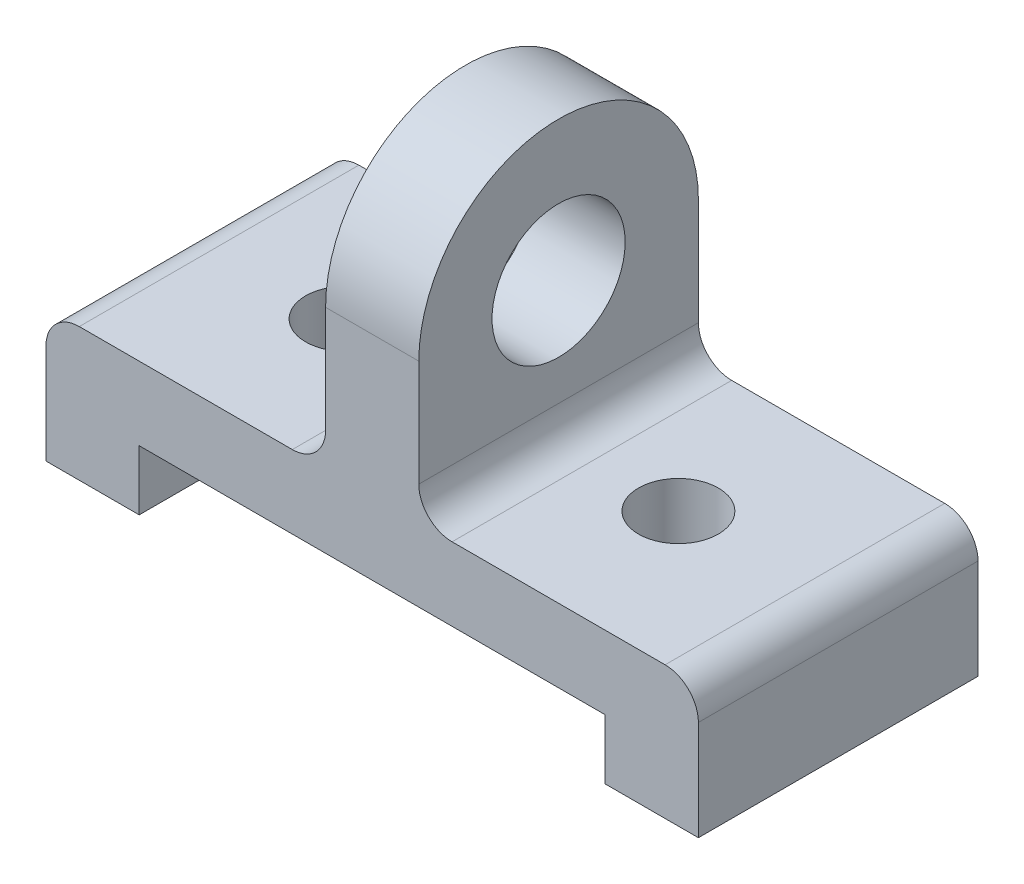
ISO-10303-21;
HEADER;
FILE_DESCRIPTION(('STEP AP214'),'2;1');
FILE_NAME('part.step','',(''),(''),'','','');
FILE_SCHEMA(('AUTOMOTIVE_DESIGN { 1 0 10303 214 1 1 1 1 }'));
ENDSEC;
DATA;
#1=APPLICATION_CONTEXT('core data for automotive mechanical design processes');
#2=APPLICATION_PROTOCOL_DEFINITION('international standard','automotive_design',2000,#1);
#3=PRODUCT_CONTEXT('',#1,'mechanical');
#4=PRODUCT('Part','Part','',(#3));
#5=PRODUCT_RELATED_PRODUCT_CATEGORY('part','',(#4));
#6=PRODUCT_DEFINITION_FORMATION('','',#4);
#7=PRODUCT_DEFINITION_CONTEXT('part definition',#1,'design');
#8=PRODUCT_DEFINITION('design','',#6,#7);
#9=PRODUCT_DEFINITION_SHAPE('','',#8);
#10=(LENGTH_UNIT() NAMED_UNIT(*) SI_UNIT(.MILLI.,.METRE.));
#11=(NAMED_UNIT(*) PLANE_ANGLE_UNIT() SI_UNIT($,.RADIAN.));
#12=(NAMED_UNIT(*) SI_UNIT($,.STERADIAN.) SOLID_ANGLE_UNIT());
#13=UNCERTAINTY_MEASURE_WITH_UNIT(LENGTH_MEASURE(1.E-05),#10,'distance_accuracy_value','');
#14=(GEOMETRIC_REPRESENTATION_CONTEXT(3) GLOBAL_UNCERTAINTY_ASSIGNED_CONTEXT((#13)) GLOBAL_UNIT_ASSIGNED_CONTEXT((#10,
#11,#12)) REPRESENTATION_CONTEXT('',''));
#15=CARTESIAN_POINT('',(0.,0.,0.));
#16=DIRECTION('',(0.,0.,1.));
#17=DIRECTION('',(1.,0.,0.));
#18=AXIS2_PLACEMENT_3D('',#15,#16,#17);
#19=CARTESIAN_POINT('',(7.,31.,0.));
#20=DIRECTION('',(-1.,0.,0.));
#21=DIRECTION('',(0.,0.,1.));
#22=AXIS2_PLACEMENT_3D('',#19,#20,#21);
#23=CYLINDRICAL_SURFACE('',#22,21.);
#24=DIRECTION('',(-1.,0.,0.));
#25=VECTOR('',#24,1.);
#26=CARTESIAN_POINT('',(-49.,31.,21.));
#27=LINE('',#26,#25);
#28=CARTESIAN_POINT('',(7.,31.,21.));
#29=VERTEX_POINT('',#28);
#30=CARTESIAN_POINT('',(-7.,31.,21.));
#31=VERTEX_POINT('',#30);
#32=EDGE_CURVE('E201',#29,#31,#27,.T.);
#33=ORIENTED_EDGE('',*,*,#32,.F.);
#34=CARTESIAN_POINT('',(7.,31.,0.));
#35=DIRECTION('',(1.,0.,0.));
#36=DIRECTION('',(0.,0.,-1.));
#37=AXIS2_PLACEMENT_3D('',#34,#35,#36);
#38=CIRCLE('',#37,21.);
#39=CARTESIAN_POINT('',(7.,31.,-21.));
#40=VERTEX_POINT('',#39);
#41=EDGE_CURVE('E207',#40,#29,#38,.T.);
#42=ORIENTED_EDGE('',*,*,#41,.F.);
#43=DIRECTION('',(-1.,0.,0.));
#44=VECTOR('',#43,1.);
#45=CARTESIAN_POINT('',(-49.,31.,-21.));
#46=LINE('',#45,#44);
#47=CARTESIAN_POINT('',(-7.,31.,-21.));
#48=VERTEX_POINT('',#47);
#49=EDGE_CURVE('E206',#48,#40,#46,.F.);
#50=ORIENTED_EDGE('',*,*,#49,.F.);
#51=CARTESIAN_POINT('',(-7.,31.,0.));
#52=DIRECTION('',(1.,0.,0.));
#53=DIRECTION('',(0.,0.,-1.));
#54=AXIS2_PLACEMENT_3D('',#51,#52,#53);
#55=CIRCLE('',#54,21.);
#56=EDGE_CURVE('E211',#31,#48,#55,.F.);
#57=ORIENTED_EDGE('',*,*,#56,.F.);
#58=EDGE_LOOP('',(#33,#42,#50,#57));
#59=FACE_BOUND('',#58,.T.);
#60=ADVANCED_FACE('F41',(#59),#23,.T.);
#61=CARTESIAN_POINT('',(0.,10.,0.));
#62=DIRECTION('',(0.,1.,0.));
#63=DIRECTION('',(0.,0.,1.));
#64=AXIS2_PLACEMENT_3D('',#61,#62,#63);
#65=PLANE('',#64);
#66=CARTESIAN_POINT('',(-25.,10.,0.));
#67=DIRECTION('',(0.,1.,0.));
#68=DIRECTION('',(0.,0.,-1.));
#69=AXIS2_PLACEMENT_3D('',#66,#67,#68);
#70=CIRCLE('',#69,6.);
#71=CARTESIAN_POINT('',(-25.,10.,-6.));
#72=VERTEX_POINT('',#71);
#73=EDGE_CURVE('E339',#72,#72,#70,.T.);
#74=ORIENTED_EDGE('',*,*,#73,.F.);
#75=EDGE_LOOP('',(#74));
#76=FACE_BOUND('',#75,.T.);
#77=DIRECTION('',(1.,0.,0.));
#78=VECTOR('',#77,1.);
#79=CARTESIAN_POINT('',(-49.,10.,21.));
#80=LINE('',#79,#78);
#81=CARTESIAN_POINT('',(-44.,10.,21.));
#82=VERTEX_POINT('',#81);
#83=CARTESIAN_POINT('',(-12.,10.,21.));
#84=VERTEX_POINT('',#83);
#85=EDGE_CURVE('E197',#82,#84,#80,.T.);
#86=ORIENTED_EDGE('',*,*,#85,.T.);
#87=DIRECTION('',(0.,0.,-1.));
#88=VECTOR('',#87,1.);
#89=CARTESIAN_POINT('',(-12.,10.,0.));
#90=LINE('',#89,#88);
#91=CARTESIAN_POINT('',(-12.,10.,-21.));
#92=VERTEX_POINT('',#91);
#93=EDGE_CURVE('E245',#84,#92,#90,.T.);
#94=ORIENTED_EDGE('',*,*,#93,.T.);
#95=DIRECTION('',(-1.,0.,0.));
#96=VECTOR('',#95,1.);
#97=CARTESIAN_POINT('',(-49.,10.,-21.));
#98=LINE('',#97,#96);
#99=CARTESIAN_POINT('',(-44.,10.,-21.));
#100=VERTEX_POINT('',#99);
#101=EDGE_CURVE('E192',#92,#100,#98,.T.);
#102=ORIENTED_EDGE('',*,*,#101,.T.);
#103=DIRECTION('',(0.,0.,1.));
#104=VECTOR('',#103,1.);
#105=CARTESIAN_POINT('',(-44.,10.,21.));
#106=LINE('',#105,#104);
#107=EDGE_CURVE('E212',#100,#82,#106,.T.);
#108=ORIENTED_EDGE('',*,*,#107,.T.);
#109=EDGE_LOOP('',(#86,#94,#102,#108));
#110=FACE_BOUND('',#109,.T.);
#111=ADVANCED_FACE('F266',(#76,#110),#65,.T.);
#112=CARTESIAN_POINT('',(0.,-10.,0.));
#113=DIRECTION('',(0.,1.,0.));
#114=DIRECTION('',(0.,0.,1.));
#115=AXIS2_PLACEMENT_3D('',#112,#113,#114);
#116=PLANE('',#115);
#117=DIRECTION('',(0.,0.,1.));
#118=VECTOR('',#117,1.);
#119=CARTESIAN_POINT('',(35.,-10.,-21.));
#120=LINE('',#119,#118);
#121=CARTESIAN_POINT('',(35.,-10.,-21.));
#122=VERTEX_POINT('',#121);
#123=CARTESIAN_POINT('',(35.,-10.,21.));
#124=VERTEX_POINT('',#123);
#125=EDGE_CURVE('E163',#122,#124,#120,.T.);
#126=ORIENTED_EDGE('',*,*,#125,.F.);
#127=DIRECTION('',(-1.,0.,0.));
#128=VECTOR('',#127,1.);
#129=CARTESIAN_POINT('',(-49.,-10.,-21.));
#130=LINE('',#129,#128);
#131=CARTESIAN_POINT('',(49.,-10.,-21.));
#132=VERTEX_POINT('',#131);
#133=EDGE_CURVE('E176',#132,#122,#130,.T.);
#134=ORIENTED_EDGE('',*,*,#133,.F.);
#135=DIRECTION('',(0.,0.,-1.));
#136=VECTOR('',#135,1.);
#137=CARTESIAN_POINT('',(49.,-10.,-21.));
#138=LINE('',#137,#136);
#139=CARTESIAN_POINT('',(49.,-10.,21.));
#140=VERTEX_POINT('',#139);
#141=EDGE_CURVE('E182',#140,#132,#138,.T.);
#142=ORIENTED_EDGE('',*,*,#141,.F.);
#143=DIRECTION('',(1.,0.,0.));
#144=VECTOR('',#143,1.);
#145=CARTESIAN_POINT('',(-49.,-10.,21.));
#146=LINE('',#145,#144);
#147=EDGE_CURVE('E186',#124,#140,#146,.T.);
#148=ORIENTED_EDGE('',*,*,#147,.F.);
#149=EDGE_LOOP('',(#126,#134,#142,#148));
#150=FACE_BOUND('',#149,.T.);
#151=ADVANCED_FACE('F320',(#150),#116,.F.);
#152=CARTESIAN_POINT('',(-49.,10.,21.));
#153=DIRECTION('',(0.,0.,-1.));
#154=DIRECTION('',(-1.,0.,0.));
#155=AXIS2_PLACEMENT_3D('',#152,#153,#154);
#156=PLANE('',#155);
#157=ORIENTED_EDGE('',*,*,#85,.F.);
#158=CARTESIAN_POINT('',(-44.,5.,21.));
#159=DIRECTION('',(0.,0.,-1.));
#160=DIRECTION('',(-1.,0.,0.));
#161=AXIS2_PLACEMENT_3D('',#158,#159,#160);
#162=CIRCLE('',#161,5.);
#163=CARTESIAN_POINT('',(-49.,5.,21.));
#164=VERTEX_POINT('',#163);
#165=EDGE_CURVE('E228',#82,#164,#162,.F.);
#166=ORIENTED_EDGE('',*,*,#165,.T.);
#167=DIRECTION('',(0.,-1.,0.));
#168=VECTOR('',#167,1.);
#169=CARTESIAN_POINT('',(-49.,10.,21.));
#170=LINE('',#169,#168);
#171=CARTESIAN_POINT('',(-49.,-10.,21.));
#172=VERTEX_POINT('',#171);
#173=EDGE_CURVE('E198',#164,#172,#170,.T.);
#174=ORIENTED_EDGE('',*,*,#173,.T.);
#175=CARTESIAN_POINT('',(-35.,-10.,21.));
#176=VERTEX_POINT('',#175);
#177=EDGE_CURVE('E193',#172,#176,#146,.T.);
#178=ORIENTED_EDGE('',*,*,#177,.T.);
#179=DIRECTION('',(0.,-1.,0.));
#180=VECTOR('',#179,1.);
#181=CARTESIAN_POINT('',(-35.,-10.,21.));
#182=LINE('',#181,#180);
#183=CARTESIAN_POINT('',(-35.,-1.00000000000001,21.));
#184=VERTEX_POINT('',#183);
#185=EDGE_CURVE('E157',#184,#176,#182,.T.);
#186=ORIENTED_EDGE('',*,*,#185,.F.);
#187=DIRECTION('',(-1.,0.,0.));
#188=VECTOR('',#187,1.);
#189=CARTESIAN_POINT('',(-35.,-1.00000000000001,21.));
#190=LINE('',#189,#188);
#191=CARTESIAN_POINT('',(35.,-1.00000000000001,21.));
#192=VERTEX_POINT('',#191);
#193=EDGE_CURVE('E171',#192,#184,#190,.T.);
#194=ORIENTED_EDGE('',*,*,#193,.F.);
#195=DIRECTION('',(0.,1.,0.));
#196=VECTOR('',#195,1.);
#197=CARTESIAN_POINT('',(35.,-1.00000000000001,21.));
#198=LINE('',#197,#196);
#199=EDGE_CURVE('E290',#124,#192,#198,.T.);
#200=ORIENTED_EDGE('',*,*,#199,.F.);
#201=ORIENTED_EDGE('',*,*,#147,.T.);
#202=DIRECTION('',(0.,-1.,0.));
#203=VECTOR('',#202,1.);
#204=CARTESIAN_POINT('',(49.,10.,21.));
#205=LINE('',#204,#203);
#206=CARTESIAN_POINT('',(49.,5.,21.));
#207=VERTEX_POINT('',#206);
#208=EDGE_CURVE('E195',#207,#140,#205,.T.);
#209=ORIENTED_EDGE('',*,*,#208,.F.);
#210=CARTESIAN_POINT('',(44.,5.,21.));
#211=DIRECTION('',(0.,0.,-1.));
#212=DIRECTION('',(-1.,0.,0.));
#213=AXIS2_PLACEMENT_3D('',#210,#211,#212);
#214=CIRCLE('',#213,5.);
#215=CARTESIAN_POINT('',(44.,10.,21.));
#216=VERTEX_POINT('',#215);
#217=EDGE_CURVE('E223',#207,#216,#214,.F.);
#218=ORIENTED_EDGE('',*,*,#217,.T.);
#219=CARTESIAN_POINT('',(12.,10.,21.));
#220=VERTEX_POINT('',#219);
#221=EDGE_CURVE('E267',#220,#216,#80,.T.);
#222=ORIENTED_EDGE('',*,*,#221,.F.);
#223=CARTESIAN_POINT('',(12.,15.,21.));
#224=DIRECTION('',(0.,0.,-1.));
#225=DIRECTION('',(-1.,0.,0.));
#226=AXIS2_PLACEMENT_3D('',#223,#224,#225);
#227=CIRCLE('',#226,5.);
#228=CARTESIAN_POINT('',(7.,15.,21.));
#229=VERTEX_POINT('',#228);
#230=EDGE_CURVE('E11',#220,#229,#227,.T.);
#231=ORIENTED_EDGE('',*,*,#230,.T.);
#232=DIRECTION('',(0.,-1.,0.));
#233=VECTOR('',#232,1.);
#234=CARTESIAN_POINT('',(7.,10.,21.));
#235=LINE('',#234,#233);
#236=EDGE_CURVE('E283',#29,#229,#235,.T.);
#237=ORIENTED_EDGE('',*,*,#236,.F.);
#238=ORIENTED_EDGE('',*,*,#32,.T.);
#239=DIRECTION('',(0.,-1.,0.));
#240=VECTOR('',#239,1.);
#241=CARTESIAN_POINT('',(-7.,10.,21.));
#242=LINE('',#241,#240);
#243=CARTESIAN_POINT('',(-7.,15.,21.));
#244=VERTEX_POINT('',#243);
#245=EDGE_CURVE('E261',#31,#244,#242,.T.);
#246=ORIENTED_EDGE('',*,*,#245,.T.);
#247=CARTESIAN_POINT('',(-12.,15.,21.));
#248=DIRECTION('',(0.,0.,-1.));
#249=DIRECTION('',(-1.,0.,0.));
#250=AXIS2_PLACEMENT_3D('',#247,#248,#249);
#251=CIRCLE('',#250,5.);
#252=EDGE_CURVE('E251',#244,#84,#251,.T.);
#253=ORIENTED_EDGE('',*,*,#252,.T.);
#254=EDGE_LOOP('',(#157,#166,#174,#178,#186,#194,#200,#201,#209,#218,#222,#231,#237,#238,#246,#253));
#255=FACE_BOUND('',#254,.T.);
#256=ADVANCED_FACE('F259',(#255),#156,.F.);
#257=CARTESIAN_POINT('',(49.,10.,-21.));
#258=DIRECTION('',(-1.,0.,0.));
#259=DIRECTION('',(0.,0.,1.));
#260=AXIS2_PLACEMENT_3D('',#257,#258,#259);
#261=PLANE('',#260);
#262=DIRECTION('',(0.,-1.,0.));
#263=VECTOR('',#262,1.);
#264=CARTESIAN_POINT('',(49.,10.,-21.));
#265=LINE('',#264,#263);
#266=CARTESIAN_POINT('',(49.,5.,-21.));
#267=VERTEX_POINT('',#266);
#268=EDGE_CURVE('E203',#267,#132,#265,.T.);
#269=ORIENTED_EDGE('',*,*,#268,.F.);
#270=DIRECTION('',(0.,0.,-1.));
#271=VECTOR('',#270,1.);
#272=CARTESIAN_POINT('',(49.,5.,21.));
#273=LINE('',#272,#271);
#274=EDGE_CURVE('E238',#267,#207,#273,.F.);
#275=ORIENTED_EDGE('',*,*,#274,.T.);
#276=ORIENTED_EDGE('',*,*,#208,.T.);
#277=ORIENTED_EDGE('',*,*,#141,.T.);
#278=EDGE_LOOP('',(#269,#275,#276,#277));
#279=FACE_BOUND('',#278,.T.);
#280=ADVANCED_FACE('F325',(#279),#261,.F.);
#281=CARTESIAN_POINT('',(-49.,10.,-21.));
#282=DIRECTION('',(0.,0.,1.));
#283=DIRECTION('',(1.,0.,0.));
#284=AXIS2_PLACEMENT_3D('',#281,#282,#283);
#285=PLANE('',#284);
#286=DIRECTION('',(0.,-1.,0.));
#287=VECTOR('',#286,1.);
#288=CARTESIAN_POINT('',(-49.,10.,-21.));
#289=LINE('',#288,#287);
#290=CARTESIAN_POINT('',(-49.,5.,-21.));
#291=VERTEX_POINT('',#290);
#292=CARTESIAN_POINT('',(-49.,-10.,-21.));
#293=VERTEX_POINT('',#292);
#294=EDGE_CURVE('E200',#291,#293,#289,.T.);
#295=ORIENTED_EDGE('',*,*,#294,.F.);
#296=CARTESIAN_POINT('',(-44.,5.,-21.));
#297=DIRECTION('',(0.,0.,1.));
#298=DIRECTION('',(1.,0.,0.));
#299=AXIS2_PLACEMENT_3D('',#296,#297,#298);
#300=CIRCLE('',#299,5.);
#301=EDGE_CURVE('E235',#291,#100,#300,.F.);
#302=ORIENTED_EDGE('',*,*,#301,.T.);
#303=ORIENTED_EDGE('',*,*,#101,.F.);
#304=CARTESIAN_POINT('',(-12.,15.,-21.));
#305=DIRECTION('',(0.,0.,1.));
#306=DIRECTION('',(1.,0.,0.));
#307=AXIS2_PLACEMENT_3D('',#304,#305,#306);
#308=CIRCLE('',#307,5.);
#309=CARTESIAN_POINT('',(-7.,15.,-21.));
#310=VERTEX_POINT('',#309);
#311=EDGE_CURVE('E253',#92,#310,#308,.T.);
#312=ORIENTED_EDGE('',*,*,#311,.T.);
#313=DIRECTION('',(0.,1.,0.));
#314=VECTOR('',#313,1.);
#315=CARTESIAN_POINT('',(-7.,10.,-21.));
#316=LINE('',#315,#314);
#317=EDGE_CURVE('E275',#310,#48,#316,.T.);
#318=ORIENTED_EDGE('',*,*,#317,.T.);
#319=ORIENTED_EDGE('',*,*,#49,.T.);
#320=DIRECTION('',(0.,1.,0.));
#321=VECTOR('',#320,1.);
#322=CARTESIAN_POINT('',(7.,10.,-21.));
#323=LINE('',#322,#321);
#324=CARTESIAN_POINT('',(7.,15.,-21.));
#325=VERTEX_POINT('',#324);
#326=EDGE_CURVE('E279',#325,#40,#323,.T.);
#327=ORIENTED_EDGE('',*,*,#326,.F.);
#328=CARTESIAN_POINT('',(12.,15.,-21.));
#329=DIRECTION('',(0.,0.,1.));
#330=DIRECTION('',(1.,0.,0.));
#331=AXIS2_PLACEMENT_3D('',#328,#329,#330);
#332=CIRCLE('',#331,5.);
#333=CARTESIAN_POINT('',(12.,10.,-21.));
#334=VERTEX_POINT('',#333);
#335=EDGE_CURVE('E47',#325,#334,#332,.T.);
#336=ORIENTED_EDGE('',*,*,#335,.T.);
#337=CARTESIAN_POINT('',(44.,10.,-21.));
#338=VERTEX_POINT('',#337);
#339=EDGE_CURVE('E298',#338,#334,#98,.T.);
#340=ORIENTED_EDGE('',*,*,#339,.F.);
#341=CARTESIAN_POINT('',(44.,5.,-21.));
#342=DIRECTION('',(0.,0.,1.));
#343=DIRECTION('',(1.,0.,0.));
#344=AXIS2_PLACEMENT_3D('',#341,#342,#343);
#345=CIRCLE('',#344,5.);
#346=EDGE_CURVE('E234',#338,#267,#345,.F.);
#347=ORIENTED_EDGE('',*,*,#346,.T.);
#348=ORIENTED_EDGE('',*,*,#268,.T.);
#349=ORIENTED_EDGE('',*,*,#133,.T.);
#350=DIRECTION('',(0.,1.,0.));
#351=VECTOR('',#350,1.);
#352=CARTESIAN_POINT('',(35.,-1.00000000000001,-21.));
#353=LINE('',#352,#351);
#354=CARTESIAN_POINT('',(35.,-1.00000000000001,-21.));
#355=VERTEX_POINT('',#354);
#356=EDGE_CURVE('E174',#122,#355,#353,.T.);
#357=ORIENTED_EDGE('',*,*,#356,.T.);
#358=DIRECTION('',(-1.,0.,0.));
#359=VECTOR('',#358,1.);
#360=CARTESIAN_POINT('',(-35.,-1.00000000000001,-21.));
#361=LINE('',#360,#359);
#362=CARTESIAN_POINT('',(-35.,-1.00000000000001,-21.));
#363=VERTEX_POINT('',#362);
#364=EDGE_CURVE('E164',#355,#363,#361,.T.);
#365=ORIENTED_EDGE('',*,*,#364,.T.);
#366=DIRECTION('',(0.,-1.,0.));
#367=VECTOR('',#366,1.);
#368=CARTESIAN_POINT('',(-35.,-10.,-21.));
#369=LINE('',#368,#367);
#370=CARTESIAN_POINT('',(-35.,-10.,-21.));
#371=VERTEX_POINT('',#370);
#372=EDGE_CURVE('E156',#363,#371,#369,.T.);
#373=ORIENTED_EDGE('',*,*,#372,.T.);
#374=EDGE_CURVE('E168',#371,#293,#130,.T.);
#375=ORIENTED_EDGE('',*,*,#374,.T.);
#376=EDGE_LOOP('',(#295,#302,#303,#312,#318,#319,#327,#336,#340,#347,#348,#349,#357,#365,#373,#375));
#377=FACE_BOUND('',#376,.T.);
#378=ADVANCED_FACE('F166',(#377),#285,.F.);
#379=CARTESIAN_POINT('',(-49.,10.,-21.));
#380=DIRECTION('',(1.,0.,0.));
#381=DIRECTION('',(0.,0.,-1.));
#382=AXIS2_PLACEMENT_3D('',#379,#380,#381);
#383=PLANE('',#382);
#384=ORIENTED_EDGE('',*,*,#173,.F.);
#385=DIRECTION('',(0.,0.,1.));
#386=VECTOR('',#385,1.);
#387=CARTESIAN_POINT('',(-49.,5.,-21.));
#388=LINE('',#387,#386);
#389=EDGE_CURVE('E226',#164,#291,#388,.F.);
#390=ORIENTED_EDGE('',*,*,#389,.T.);
#391=ORIENTED_EDGE('',*,*,#294,.T.);
#392=DIRECTION('',(0.,0.,1.));
#393=VECTOR('',#392,1.);
#394=CARTESIAN_POINT('',(-49.,-10.,-21.));
#395=LINE('',#394,#393);
#396=EDGE_CURVE('E180',#293,#172,#395,.T.);
#397=ORIENTED_EDGE('',*,*,#396,.T.);
#398=EDGE_LOOP('',(#384,#390,#391,#397));
#399=FACE_BOUND('',#398,.T.);
#400=ADVANCED_FACE('F301',(#399),#383,.F.);
#401=CARTESIAN_POINT('',(25.,10.,0.));
#402=DIRECTION('',(0.,1.,0.));
#403=DIRECTION('',(0.,0.,1.));
#404=AXIS2_PLACEMENT_3D('',#401,#402,#403);
#405=CIRCLE('',#404,6.);
#406=CARTESIAN_POINT('',(25.,10.,6.));
#407=VERTEX_POINT('',#406);
#408=EDGE_CURVE('E218',#407,#407,#405,.T.);
#409=ORIENTED_EDGE('',*,*,#408,.F.);
#410=EDGE_LOOP('',(#409));
#411=FACE_BOUND('',#410,.T.);
#412=ORIENTED_EDGE('',*,*,#339,.T.);
#413=DIRECTION('',(0.,0.,-1.));
#414=VECTOR('',#413,1.);
#415=CARTESIAN_POINT('',(12.,10.,21.));
#416=LINE('',#415,#414);
#417=EDGE_CURVE('E65',#334,#220,#416,.F.);
#418=ORIENTED_EDGE('',*,*,#417,.T.);
#419=ORIENTED_EDGE('',*,*,#221,.T.);
#420=DIRECTION('',(0.,0.,-1.));
#421=VECTOR('',#420,1.);
#422=CARTESIAN_POINT('',(44.,10.,-21.));
#423=LINE('',#422,#421);
#424=EDGE_CURVE('E240',#216,#338,#423,.T.);
#425=ORIENTED_EDGE('',*,*,#424,.T.);
#426=EDGE_LOOP('',(#412,#418,#419,#425));
#427=FACE_BOUND('',#426,.T.);
#428=ADVANCED_FACE('F346',(#411,#427),#65,.T.);
#429=ORIENTED_EDGE('',*,*,#374,.F.);
#430=DIRECTION('',(0.,0.,1.));
#431=VECTOR('',#430,1.);
#432=CARTESIAN_POINT('',(-35.,-10.,-21.));
#433=LINE('',#432,#431);
#434=EDGE_CURVE('E153',#371,#176,#433,.T.);
#435=ORIENTED_EDGE('',*,*,#434,.T.);
#436=ORIENTED_EDGE('',*,*,#177,.F.);
#437=ORIENTED_EDGE('',*,*,#396,.F.);
#438=EDGE_LOOP('',(#429,#435,#436,#437));
#439=FACE_BOUND('',#438,.T.);
#440=ADVANCED_FACE('F179',(#439),#116,.F.);
#441=CARTESIAN_POINT('',(-35.,-10.,-21.));
#442=DIRECTION('',(-1.,0.,0.));
#443=DIRECTION('',(0.,0.,1.));
#444=AXIS2_PLACEMENT_3D('',#441,#442,#443);
#445=PLANE('',#444);
#446=ORIENTED_EDGE('',*,*,#185,.T.);
#447=ORIENTED_EDGE('',*,*,#434,.F.);
#448=ORIENTED_EDGE('',*,*,#372,.F.);
#449=DIRECTION('',(0.,0.,1.));
#450=VECTOR('',#449,1.);
#451=CARTESIAN_POINT('',(-35.,-1.00000000000001,-21.));
#452=LINE('',#451,#450);
#453=EDGE_CURVE('E183',#363,#184,#452,.T.);
#454=ORIENTED_EDGE('',*,*,#453,.T.);
#455=EDGE_LOOP('',(#446,#447,#448,#454));
#456=FACE_BOUND('',#455,.T.);
#457=ADVANCED_FACE('F154',(#456),#445,.F.);
#458=CARTESIAN_POINT('',(-35.,-1.00000000000001,-21.));
#459=DIRECTION('',(0.,1.,0.));
#460=DIRECTION('',(0.,0.,1.));
#461=AXIS2_PLACEMENT_3D('',#458,#459,#460);
#462=PLANE('',#461);
#463=CARTESIAN_POINT('',(25.,-1.00000000000001,0.));
#464=DIRECTION('',(0.,1.,0.));
#465=DIRECTION('',(0.,0.,1.));
#466=AXIS2_PLACEMENT_3D('',#463,#464,#465);
#467=CIRCLE('',#466,6.);
#468=CARTESIAN_POINT('',(25.,-1.00000000000001,6.));
#469=VERTEX_POINT('',#468);
#470=EDGE_CURVE('E217',#469,#469,#467,.T.);
#471=ORIENTED_EDGE('',*,*,#470,.T.);
#472=EDGE_LOOP('',(#471));
#473=FACE_BOUND('',#472,.T.);
#474=CARTESIAN_POINT('',(-25.,-1.00000000000001,0.));
#475=DIRECTION('',(0.,1.,0.));
#476=DIRECTION('',(0.,0.,1.));
#477=AXIS2_PLACEMENT_3D('',#474,#475,#476);
#478=CIRCLE('',#477,6.);
#479=CARTESIAN_POINT('',(-25.,-1.00000000000001,6.));
#480=VERTEX_POINT('',#479);
#481=EDGE_CURVE('E214',#480,#480,#478,.T.);
#482=ORIENTED_EDGE('',*,*,#481,.T.);
#483=EDGE_LOOP('',(#482));
#484=FACE_BOUND('',#483,.T.);
#485=ORIENTED_EDGE('',*,*,#193,.T.);
#486=ORIENTED_EDGE('',*,*,#453,.F.);
#487=ORIENTED_EDGE('',*,*,#364,.F.);
#488=DIRECTION('',(0.,0.,1.));
#489=VECTOR('',#488,1.);
#490=CARTESIAN_POINT('',(35.,-1.00000000000001,-21.));
#491=LINE('',#490,#489);
#492=EDGE_CURVE('E294',#355,#192,#491,.T.);
#493=ORIENTED_EDGE('',*,*,#492,.T.);
#494=EDGE_LOOP('',(#485,#486,#487,#493));
#495=FACE_BOUND('',#494,.T.);
#496=ADVANCED_FACE('F313',(#473,#484,#495),#462,.F.);
#497=CARTESIAN_POINT('',(35.,-1.00000000000001,-21.));
#498=DIRECTION('',(1.,0.,0.));
#499=DIRECTION('',(0.,0.,-1.));
#500=AXIS2_PLACEMENT_3D('',#497,#498,#499);
#501=PLANE('',#500);
#502=ORIENTED_EDGE('',*,*,#199,.T.);
#503=ORIENTED_EDGE('',*,*,#492,.F.);
#504=ORIENTED_EDGE('',*,*,#356,.F.);
#505=ORIENTED_EDGE('',*,*,#125,.T.);
#506=EDGE_LOOP('',(#502,#503,#504,#505));
#507=FACE_BOUND('',#506,.T.);
#508=ADVANCED_FACE('F311',(#507),#501,.F.);
#509=CARTESIAN_POINT('',(7.,0.,0.));
#510=DIRECTION('',(1.,0.,0.));
#511=DIRECTION('',(0.,0.,-1.));
#512=AXIS2_PLACEMENT_3D('',#509,#510,#511);
#513=PLANE('',#512);
#514=CARTESIAN_POINT('',(7.,31.,0.));
#515=DIRECTION('',(1.,0.,0.));
#516=DIRECTION('',(0.,0.,-1.));
#517=AXIS2_PLACEMENT_3D('',#514,#515,#516);
#518=CIRCLE('',#517,10.);
#519=CARTESIAN_POINT('',(7.,31.,-10.));
#520=VERTEX_POINT('',#519);
#521=EDGE_CURVE('E225',#520,#520,#518,.T.);
#522=ORIENTED_EDGE('',*,*,#521,.F.);
#523=EDGE_LOOP('',(#522));
#524=FACE_BOUND('',#523,.T.);
#525=ORIENTED_EDGE('',*,*,#236,.T.);
#526=DIRECTION('',(0.,0.,-1.));
#527=VECTOR('',#526,1.);
#528=CARTESIAN_POINT('',(7.,15.,-21.));
#529=LINE('',#528,#527);
#530=EDGE_CURVE('E249',#229,#325,#529,.T.);
#531=ORIENTED_EDGE('',*,*,#530,.T.);
#532=ORIENTED_EDGE('',*,*,#326,.T.);
#533=ORIENTED_EDGE('',*,*,#41,.T.);
#534=EDGE_LOOP('',(#525,#531,#532,#533));
#535=FACE_BOUND('',#534,.T.);
#536=ADVANCED_FACE('F331',(#524,#535),#513,.T.);
#537=CARTESIAN_POINT('',(-7.,0.,0.));
#538=DIRECTION('',(1.,0.,0.));
#539=DIRECTION('',(0.,0.,-1.));
#540=AXIS2_PLACEMENT_3D('',#537,#538,#539);
#541=PLANE('',#540);
#542=CARTESIAN_POINT('',(-7.,31.,0.));
#543=DIRECTION('',(1.,0.,0.));
#544=DIRECTION('',(0.,0.,-1.));
#545=AXIS2_PLACEMENT_3D('',#542,#543,#544);
#546=CIRCLE('',#545,10.);
#547=CARTESIAN_POINT('',(-7.,31.,-10.));
#548=VERTEX_POINT('',#547);
#549=EDGE_CURVE('E277',#548,#548,#546,.T.);
#550=ORIENTED_EDGE('',*,*,#549,.T.);
#551=EDGE_LOOP('',(#550));
#552=FACE_BOUND('',#551,.T.);
#553=ORIENTED_EDGE('',*,*,#317,.F.);
#554=DIRECTION('',(0.,0.,-1.));
#555=VECTOR('',#554,1.);
#556=CARTESIAN_POINT('',(-7.,15.,0.));
#557=LINE('',#556,#555);
#558=EDGE_CURVE('E241',#310,#244,#557,.F.);
#559=ORIENTED_EDGE('',*,*,#558,.T.);
#560=ORIENTED_EDGE('',*,*,#245,.F.);
#561=ORIENTED_EDGE('',*,*,#56,.T.);
#562=EDGE_LOOP('',(#553,#559,#560,#561));
#563=FACE_BOUND('',#562,.T.);
#564=ADVANCED_FACE('F273',(#552,#563),#541,.F.);
#565=CARTESIAN_POINT('',(-7.,31.,0.));
#566=DIRECTION('',(1.,0.,0.));
#567=DIRECTION('',(0.,0.,-1.));
#568=AXIS2_PLACEMENT_3D('',#565,#566,#567);
#569=CYLINDRICAL_SURFACE('',#568,10.);
#570=ORIENTED_EDGE('',*,*,#549,.F.);
#571=EDGE_LOOP('',(#570));
#572=FACE_BOUND('',#571,.T.);
#573=ORIENTED_EDGE('',*,*,#521,.T.);
#574=EDGE_LOOP('',(#573));
#575=FACE_BOUND('',#574,.T.);
#576=ADVANCED_FACE('F425',(#572,#575),#569,.F.);
#577=CARTESIAN_POINT('',(-25.,-4.,0.));
#578=DIRECTION('',(0.,1.,0.));
#579=DIRECTION('',(0.,0.,1.));
#580=AXIS2_PLACEMENT_3D('',#577,#578,#579);
#581=CYLINDRICAL_SURFACE('',#580,6.);
#582=ORIENTED_EDGE('',*,*,#73,.T.);
#583=EDGE_LOOP('',(#582));
#584=FACE_BOUND('',#583,.T.);
#585=ORIENTED_EDGE('',*,*,#481,.F.);
#586=EDGE_LOOP('',(#585));
#587=FACE_BOUND('',#586,.T.);
#588=ADVANCED_FACE('F414',(#584,#587),#581,.F.);
#589=CARTESIAN_POINT('',(25.,-4.,0.));
#590=DIRECTION('',(0.,1.,0.));
#591=DIRECTION('',(0.,0.,1.));
#592=AXIS2_PLACEMENT_3D('',#589,#590,#591);
#593=CYLINDRICAL_SURFACE('',#592,6.);
#594=ORIENTED_EDGE('',*,*,#408,.T.);
#595=EDGE_LOOP('',(#594));
#596=FACE_BOUND('',#595,.T.);
#597=ORIENTED_EDGE('',*,*,#470,.F.);
#598=EDGE_LOOP('',(#597));
#599=FACE_BOUND('',#598,.T.);
#600=ADVANCED_FACE('F341',(#596,#599),#593,.F.);
#601=CARTESIAN_POINT('',(-44.,5.,0.));
#602=DIRECTION('',(0.,0.,-1.));
#603=DIRECTION('',(-1.,0.,0.));
#604=AXIS2_PLACEMENT_3D('',#601,#602,#603);
#605=CYLINDRICAL_SURFACE('',#604,5.);
#606=ORIENTED_EDGE('',*,*,#301,.F.);
#607=ORIENTED_EDGE('',*,*,#389,.F.);
#608=ORIENTED_EDGE('',*,*,#165,.F.);
#609=ORIENTED_EDGE('',*,*,#107,.F.);
#610=EDGE_LOOP('',(#606,#607,#608,#609));
#611=FACE_BOUND('',#610,.T.);
#612=ADVANCED_FACE('F304',(#611),#605,.T.);
#613=CARTESIAN_POINT('',(44.,5.,0.));
#614=DIRECTION('',(0.,0.,1.));
#615=DIRECTION('',(1.,0.,0.));
#616=AXIS2_PLACEMENT_3D('',#613,#614,#615);
#617=CYLINDRICAL_SURFACE('',#616,5.);
#618=ORIENTED_EDGE('',*,*,#217,.F.);
#619=ORIENTED_EDGE('',*,*,#274,.F.);
#620=ORIENTED_EDGE('',*,*,#346,.F.);
#621=ORIENTED_EDGE('',*,*,#424,.F.);
#622=EDGE_LOOP('',(#618,#619,#620,#621));
#623=FACE_BOUND('',#622,.T.);
#624=ADVANCED_FACE('F326',(#623),#617,.T.);
#625=CARTESIAN_POINT('',(-12.,15.,0.));
#626=DIRECTION('',(0.,0.,-1.));
#627=DIRECTION('',(-1.,0.,0.));
#628=AXIS2_PLACEMENT_3D('',#625,#626,#627);
#629=CYLINDRICAL_SURFACE('',#628,5.);
#630=ORIENTED_EDGE('',*,*,#252,.F.);
#631=ORIENTED_EDGE('',*,*,#558,.F.);
#632=ORIENTED_EDGE('',*,*,#311,.F.);
#633=ORIENTED_EDGE('',*,*,#93,.F.);
#634=EDGE_LOOP('',(#630,#631,#632,#633));
#635=FACE_BOUND('',#634,.T.);
#636=ADVANCED_FACE('F269',(#635),#629,.F.);
#637=CARTESIAN_POINT('',(12.,15.,0.));
#638=DIRECTION('',(0.,0.,1.));
#639=DIRECTION('',(1.,0.,0.));
#640=AXIS2_PLACEMENT_3D('',#637,#638,#639);
#641=CYLINDRICAL_SURFACE('',#640,5.);
#642=ORIENTED_EDGE('',*,*,#230,.F.);
#643=ORIENTED_EDGE('',*,*,#417,.F.);
#644=ORIENTED_EDGE('',*,*,#335,.F.);
#645=ORIENTED_EDGE('',*,*,#530,.F.);
#646=EDGE_LOOP('',(#642,#643,#644,#645));
#647=FACE_BOUND('',#646,.T.);
#648=ADVANCED_FACE('F43',(#647),#641,.F.);
#649=CLOSED_SHELL('',(#60,#111,#151,#256,#280,#378,#400,#428,#440,#457,#496,#508,#536,#564,#576,
#588,#600,#612,#624,#636,#648));
#650=MANIFOLD_SOLID_BREP('B2',#649);
#651=ADVANCED_BREP_SHAPE_REPRESENTATION('',(#18,#650),#14);
#652=SHAPE_DEFINITION_REPRESENTATION(#9,#651);
ENDSEC;
END-ISO-10303-21;
